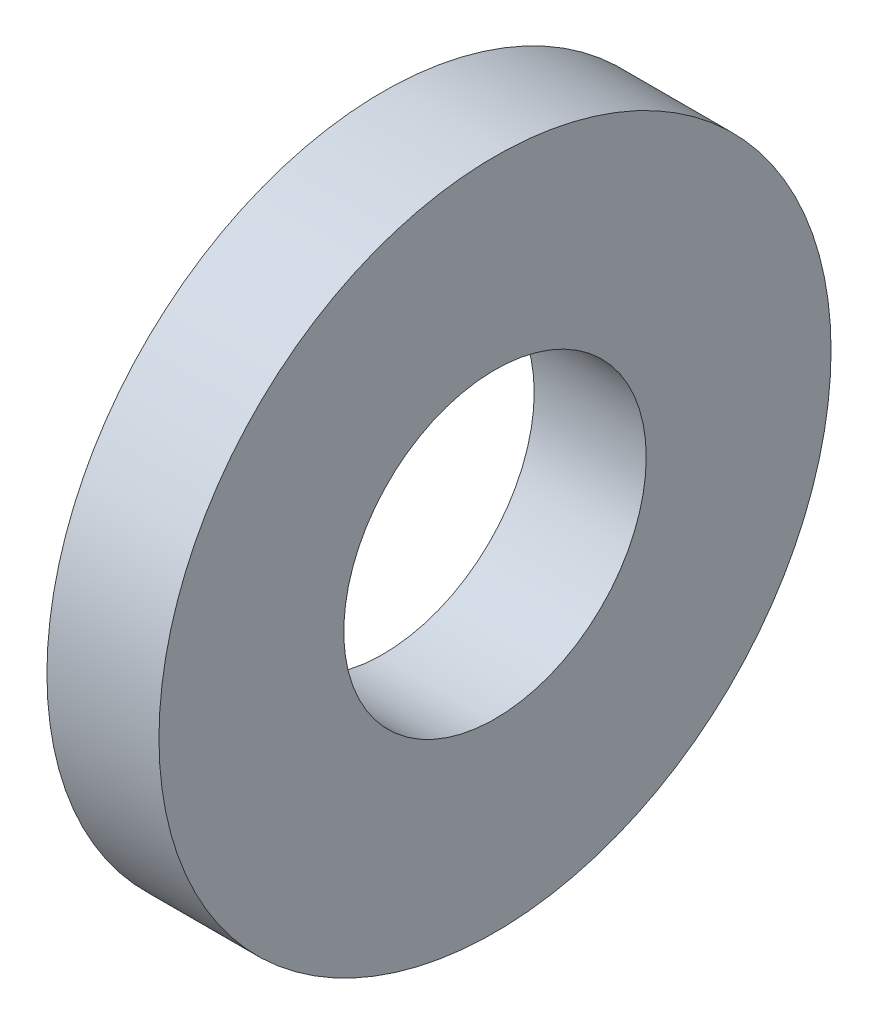
ISO-10303-21;
HEADER;
FILE_DESCRIPTION(('STEP AP214'),'2;1');
FILE_NAME('part.step','',(''),(''),'','','');
FILE_SCHEMA(('AUTOMOTIVE_DESIGN { 1 0 10303 214 1 1 1 1 }'));
ENDSEC;
DATA;
#1=APPLICATION_CONTEXT('core data for automotive mechanical design processes');
#2=APPLICATION_PROTOCOL_DEFINITION('international standard','automotive_design',2000,#1);
#3=PRODUCT_CONTEXT('',#1,'mechanical');
#4=PRODUCT('Part','Part','',(#3));
#5=PRODUCT_RELATED_PRODUCT_CATEGORY('part','',(#4));
#6=PRODUCT_DEFINITION_FORMATION('','',#4);
#7=PRODUCT_DEFINITION_CONTEXT('part definition',#1,'design');
#8=PRODUCT_DEFINITION('design','',#6,#7);
#9=PRODUCT_DEFINITION_SHAPE('','',#8);
#10=(LENGTH_UNIT() NAMED_UNIT(*) SI_UNIT(.MILLI.,.METRE.));
#11=(NAMED_UNIT(*) PLANE_ANGLE_UNIT() SI_UNIT($,.RADIAN.));
#12=(NAMED_UNIT(*) SI_UNIT($,.STERADIAN.) SOLID_ANGLE_UNIT());
#13=UNCERTAINTY_MEASURE_WITH_UNIT(LENGTH_MEASURE(1.E-05),#10,'distance_accuracy_value','');
#14=(GEOMETRIC_REPRESENTATION_CONTEXT(3) GLOBAL_UNCERTAINTY_ASSIGNED_CONTEXT((#13)) GLOBAL_UNIT_ASSIGNED_CONTEXT((#10,
#11,#12)) REPRESENTATION_CONTEXT('',''));
#15=CARTESIAN_POINT('',(0.,0.,0.));
#16=DIRECTION('',(0.,0.,1.));
#17=DIRECTION('',(1.,0.,0.));
#18=AXIS2_PLACEMENT_3D('',#15,#16,#17);
#19=CARTESIAN_POINT('',(0.004200000000026,6.0042,6.004198384862));
#20=DIRECTION('',(1.,0.,0.));
#21=DIRECTION('',(0.,0.,-1.));
#22=AXIS2_PLACEMENT_3D('',#19,#20,#21);
#23=PLANE('',#22);
#24=CARTESIAN_POINT('',(0.004200000000026,6.0042,6.004198384862));
#25=DIRECTION('',(1.,0.,0.));
#26=DIRECTION('',(0.,0.,-1.));
#27=AXIS2_PLACEMENT_3D('',#24,#25,#26);
#28=CIRCLE('',#27,2.7);
#29=CARTESIAN_POINT('',(0.004200000000026,6.0042,3.304198384862));
#30=VERTEX_POINT('',#29);
#31=EDGE_CURVE('E26',#30,#30,#28,.T.);
#32=ORIENTED_EDGE('',*,*,#31,.T.);
#33=EDGE_LOOP('',(#32));
#34=FACE_BOUND('',#33,.T.);
#35=CARTESIAN_POINT('',(0.004200000000026,6.0042,6.004198384862));
#36=DIRECTION('',(1.,0.,0.));
#37=DIRECTION('',(0.,0.,-1.));
#38=AXIS2_PLACEMENT_3D('',#35,#36,#37);
#39=CIRCLE('',#38,6.);
#40=CARTESIAN_POINT('',(0.004200000000026,6.0042,0.00419838486199944));
#41=VERTEX_POINT('',#40);
#42=EDGE_CURVE('E17',#41,#41,#39,.T.);
#43=ORIENTED_EDGE('',*,*,#42,.F.);
#44=EDGE_LOOP('',(#43));
#45=FACE_BOUND('',#44,.T.);
#46=ADVANCED_FACE('F14',(#34,#45),#23,.F.);
#47=CARTESIAN_POINT('',(0.004200000000026,6.0042,6.004198384862));
#48=DIRECTION('',(1.,0.,0.));
#49=DIRECTION('',(0.,0.,-1.));
#50=AXIS2_PLACEMENT_3D('',#47,#48,#49);
#51=CYLINDRICAL_SURFACE('',#50,6.);
#52=ORIENTED_EDGE('',*,*,#42,.T.);
#53=EDGE_LOOP('',(#52));
#54=FACE_BOUND('',#53,.T.);
#55=CARTESIAN_POINT('',(2.0042,6.0042,6.004198384862));
#56=DIRECTION('',(1.,0.,0.));
#57=DIRECTION('',(0.,0.,-1.));
#58=AXIS2_PLACEMENT_3D('',#55,#56,#57);
#59=CIRCLE('',#58,6.);
#60=CARTESIAN_POINT('',(2.0042,6.0042,0.00419838486199944));
#61=VERTEX_POINT('',#60);
#62=EDGE_CURVE('E21',#61,#61,#59,.T.);
#63=ORIENTED_EDGE('',*,*,#62,.F.);
#64=EDGE_LOOP('',(#63));
#65=FACE_BOUND('',#64,.T.);
#66=ADVANCED_FACE('F34',(#54,#65),#51,.T.);
#67=CARTESIAN_POINT('',(0.004200000000026,6.0042,6.004198384862));
#68=DIRECTION('',(1.,0.,0.));
#69=DIRECTION('',(0.,0.,-1.));
#70=AXIS2_PLACEMENT_3D('',#67,#68,#69);
#71=CYLINDRICAL_SURFACE('',#70,2.7);
#72=ORIENTED_EDGE('',*,*,#31,.F.);
#73=EDGE_LOOP('',(#72));
#74=FACE_BOUND('',#73,.T.);
#75=CARTESIAN_POINT('',(2.0042,6.0042,6.004198384862));
#76=DIRECTION('',(1.,0.,0.));
#77=DIRECTION('',(0.,0.,-1.));
#78=AXIS2_PLACEMENT_3D('',#75,#76,#77);
#79=CIRCLE('',#78,2.7);
#80=CARTESIAN_POINT('',(2.0042,6.0042,3.304198384862));
#81=VERTEX_POINT('',#80);
#82=EDGE_CURVE('E10',#81,#81,#79,.F.);
#83=ORIENTED_EDGE('',*,*,#82,.F.);
#84=EDGE_LOOP('',(#83));
#85=FACE_BOUND('',#84,.T.);
#86=ADVANCED_FACE('F42',(#74,#85),#71,.F.);
#87=CARTESIAN_POINT('',(2.0042,6.0042,6.004198384862));
#88=DIRECTION('',(1.,0.,0.));
#89=DIRECTION('',(0.,0.,-1.));
#90=AXIS2_PLACEMENT_3D('',#87,#88,#89);
#91=PLANE('',#90);
#92=ORIENTED_EDGE('',*,*,#82,.T.);
#93=EDGE_LOOP('',(#92));
#94=FACE_BOUND('',#93,.T.);
#95=ORIENTED_EDGE('',*,*,#62,.T.);
#96=EDGE_LOOP('',(#95));
#97=FACE_BOUND('',#96,.T.);
#98=ADVANCED_FACE('F43',(#94,#97),#91,.T.);
#99=CLOSED_SHELL('',(#46,#66,#86,#98));
#100=MANIFOLD_SOLID_BREP('B1',#99);
#101=ADVANCED_BREP_SHAPE_REPRESENTATION('',(#18,#100),#14);
#102=SHAPE_DEFINITION_REPRESENTATION(#9,#101);
ENDSEC;
END-ISO-10303-21;
